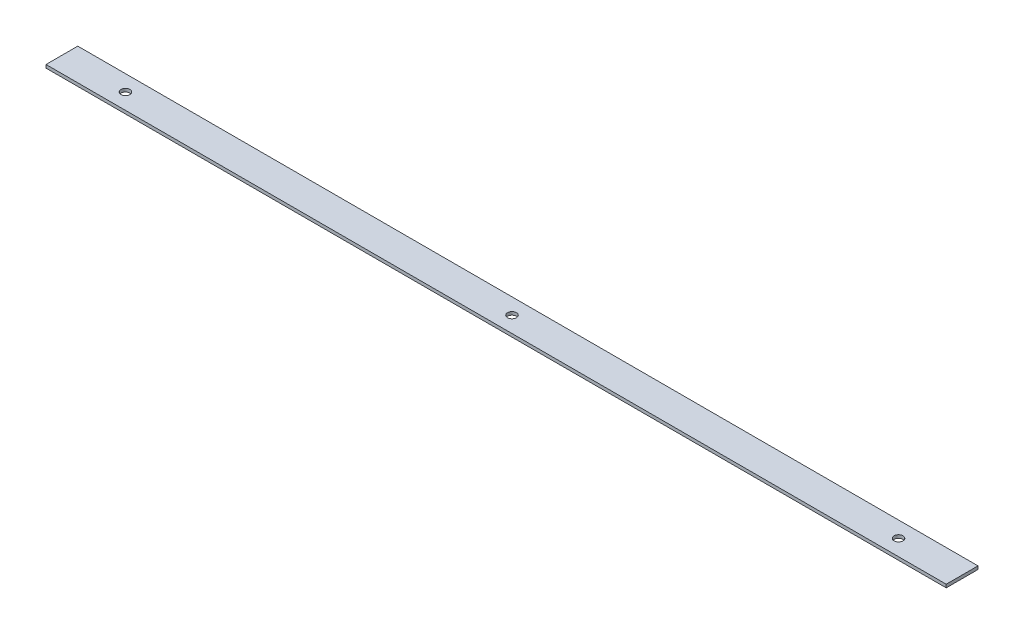
ISO-10303-21;
HEADER;
FILE_DESCRIPTION(('STEP AP214'),'2;1');
FILE_NAME('part.step','',(''),(''),'','','');
FILE_SCHEMA(('AUTOMOTIVE_DESIGN { 1 0 10303 214 1 1 1 1 }'));
ENDSEC;
DATA;
#1=APPLICATION_CONTEXT('core data for automotive mechanical design processes');
#2=APPLICATION_PROTOCOL_DEFINITION('international standard','automotive_design',2000,#1);
#3=PRODUCT_CONTEXT('',#1,'mechanical');
#4=PRODUCT('Part','Part','',(#3));
#5=PRODUCT_RELATED_PRODUCT_CATEGORY('part','',(#4));
#6=PRODUCT_DEFINITION_FORMATION('','',#4);
#7=PRODUCT_DEFINITION_CONTEXT('part definition',#1,'design');
#8=PRODUCT_DEFINITION('design','',#6,#7);
#9=PRODUCT_DEFINITION_SHAPE('','',#8);
#10=(LENGTH_UNIT() NAMED_UNIT(*) SI_UNIT(.MILLI.,.METRE.));
#11=(NAMED_UNIT(*) PLANE_ANGLE_UNIT() SI_UNIT($,.RADIAN.));
#12=(NAMED_UNIT(*) SI_UNIT($,.STERADIAN.) SOLID_ANGLE_UNIT());
#13=UNCERTAINTY_MEASURE_WITH_UNIT(LENGTH_MEASURE(1.E-05),#10,'distance_accuracy_value','');
#14=(GEOMETRIC_REPRESENTATION_CONTEXT(3) GLOBAL_UNCERTAINTY_ASSIGNED_CONTEXT((#13)) GLOBAL_UNIT_ASSIGNED_CONTEXT((#10,
#11,#12)) REPRESENTATION_CONTEXT('',''));
#15=CARTESIAN_POINT('',(0.,0.,0.));
#16=DIRECTION('',(0.,0.,1.));
#17=DIRECTION('',(1.,0.,0.));
#18=AXIS2_PLACEMENT_3D('',#15,#16,#17);
#19=CARTESIAN_POINT('',(304.,0.,0.));
#20=DIRECTION('',(0.,1.,0.));
#21=DIRECTION('',(0.,0.,1.));
#22=AXIS2_PLACEMENT_3D('',#19,#20,#21);
#23=CYLINDRICAL_SURFACE('',#22,3.50000000000008);
#24=CARTESIAN_POINT('',(304.,0.,0.));
#25=DIRECTION('',(0.,1.,0.));
#26=DIRECTION('',(0.,0.,1.));
#27=AXIS2_PLACEMENT_3D('',#24,#25,#26);
#28=CIRCLE('',#27,3.50000000000008);
#29=CARTESIAN_POINT('',(304.,0.,3.50000000000008));
#30=VERTEX_POINT('',#29);
#31=EDGE_CURVE('E48',#30,#30,#28,.T.);
#32=ORIENTED_EDGE('',*,*,#31,.F.);
#33=EDGE_LOOP('',(#32));
#34=FACE_BOUND('',#33,.T.);
#35=CARTESIAN_POINT('',(304.,2.5,0.));
#36=DIRECTION('',(0.,-1.,0.));
#37=DIRECTION('',(0.,0.,-1.));
#38=AXIS2_PLACEMENT_3D('',#35,#36,#37);
#39=CIRCLE('',#38,3.50000000000008);
#40=CARTESIAN_POINT('',(304.,2.5,-3.50000000000008));
#41=VERTEX_POINT('',#40);
#42=EDGE_CURVE('E11',#41,#41,#39,.T.);
#43=ORIENTED_EDGE('',*,*,#42,.F.);
#44=EDGE_LOOP('',(#43));
#45=FACE_BOUND('',#44,.T.);
#46=ADVANCED_FACE('F39',(#34,#45),#23,.F.);
#47=CARTESIAN_POINT('',(354.,2.5,12.5));
#48=DIRECTION('',(-1.,0.,0.));
#49=DIRECTION('',(0.,0.,1.));
#50=AXIS2_PLACEMENT_3D('',#47,#48,#49);
#51=PLANE('',#50);
#52=DIRECTION('',(0.,0.,-1.));
#53=VECTOR('',#52,1.);
#54=CARTESIAN_POINT('',(354.,0.,12.5));
#55=LINE('',#54,#53);
#56=CARTESIAN_POINT('',(354.,0.,12.5));
#57=VERTEX_POINT('',#56);
#58=CARTESIAN_POINT('',(354.,0.,-12.5));
#59=VERTEX_POINT('',#58);
#60=EDGE_CURVE('E112',#57,#59,#55,.T.);
#61=ORIENTED_EDGE('',*,*,#60,.T.);
#62=DIRECTION('',(0.,-1.,0.));
#63=VECTOR('',#62,1.);
#64=CARTESIAN_POINT('',(354.,2.5,-12.5));
#65=LINE('',#64,#63);
#66=CARTESIAN_POINT('',(354.,2.5,-12.5));
#67=VERTEX_POINT('',#66);
#68=EDGE_CURVE('E101',#67,#59,#65,.T.);
#69=ORIENTED_EDGE('',*,*,#68,.F.);
#70=DIRECTION('',(0.,0.,-1.));
#71=VECTOR('',#70,1.);
#72=CARTESIAN_POINT('',(354.,2.5,12.5));
#73=LINE('',#72,#71);
#74=CARTESIAN_POINT('',(354.,2.5,12.5));
#75=VERTEX_POINT('',#74);
#76=EDGE_CURVE('E93',#75,#67,#73,.T.);
#77=ORIENTED_EDGE('',*,*,#76,.F.);
#78=DIRECTION('',(0.,-1.,0.));
#79=VECTOR('',#78,1.);
#80=CARTESIAN_POINT('',(354.,2.5,12.5));
#81=LINE('',#80,#79);
#82=EDGE_CURVE('E108',#75,#57,#81,.T.);
#83=ORIENTED_EDGE('',*,*,#82,.T.);
#84=EDGE_LOOP('',(#61,#69,#77,#83));
#85=FACE_BOUND('',#84,.T.);
#86=ADVANCED_FACE('F136',(#85),#51,.F.);
#87=CARTESIAN_POINT('',(-354.,2.5,-12.5));
#88=DIRECTION('',(0.,0.,1.));
#89=DIRECTION('',(1.,0.,0.));
#90=AXIS2_PLACEMENT_3D('',#87,#88,#89);
#91=PLANE('',#90);
#92=DIRECTION('',(-1.,0.,0.));
#93=VECTOR('',#92,1.);
#94=CARTESIAN_POINT('',(-354.,0.,-12.5));
#95=LINE('',#94,#93);
#96=CARTESIAN_POINT('',(-354.,0.,-12.5));
#97=VERTEX_POINT('',#96);
#98=EDGE_CURVE('E99',#59,#97,#95,.T.);
#99=ORIENTED_EDGE('',*,*,#98,.T.);
#100=DIRECTION('',(0.,-1.,0.));
#101=VECTOR('',#100,1.);
#102=CARTESIAN_POINT('',(-354.,2.5,-12.5));
#103=LINE('',#102,#101);
#104=CARTESIAN_POINT('',(-354.,2.5,-12.5));
#105=VERTEX_POINT('',#104);
#106=EDGE_CURVE('E97',#105,#97,#103,.T.);
#107=ORIENTED_EDGE('',*,*,#106,.F.);
#108=DIRECTION('',(-1.,0.,0.));
#109=VECTOR('',#108,1.);
#110=CARTESIAN_POINT('',(-354.,2.5,-12.5));
#111=LINE('',#110,#109);
#112=EDGE_CURVE('E87',#67,#105,#111,.T.);
#113=ORIENTED_EDGE('',*,*,#112,.F.);
#114=ORIENTED_EDGE('',*,*,#68,.T.);
#115=EDGE_LOOP('',(#99,#107,#113,#114));
#116=FACE_BOUND('',#115,.T.);
#117=ADVANCED_FACE('F98',(#116),#91,.F.);
#118=CARTESIAN_POINT('',(-354.,2.5,12.5));
#119=DIRECTION('',(1.,0.,0.));
#120=DIRECTION('',(0.,0.,-1.));
#121=AXIS2_PLACEMENT_3D('',#118,#119,#120);
#122=PLANE('',#121);
#123=DIRECTION('',(0.,0.,1.));
#124=VECTOR('',#123,1.);
#125=CARTESIAN_POINT('',(-354.,0.,12.5));
#126=LINE('',#125,#124);
#127=CARTESIAN_POINT('',(-354.,0.,12.5));
#128=VERTEX_POINT('',#127);
#129=EDGE_CURVE('E73',#97,#128,#126,.T.);
#130=ORIENTED_EDGE('',*,*,#129,.T.);
#131=DIRECTION('',(0.,-1.,0.));
#132=VECTOR('',#131,1.);
#133=CARTESIAN_POINT('',(-354.,2.5,12.5));
#134=LINE('',#133,#132);
#135=CARTESIAN_POINT('',(-354.,2.5,12.5));
#136=VERTEX_POINT('',#135);
#137=EDGE_CURVE('E102',#136,#128,#134,.T.);
#138=ORIENTED_EDGE('',*,*,#137,.F.);
#139=DIRECTION('',(0.,0.,1.));
#140=VECTOR('',#139,1.);
#141=CARTESIAN_POINT('',(-354.,2.5,12.5));
#142=LINE('',#141,#140);
#143=EDGE_CURVE('E91',#105,#136,#142,.T.);
#144=ORIENTED_EDGE('',*,*,#143,.F.);
#145=ORIENTED_EDGE('',*,*,#106,.T.);
#146=EDGE_LOOP('',(#130,#138,#144,#145));
#147=FACE_BOUND('',#146,.T.);
#148=ADVANCED_FACE('F104',(#147),#122,.F.);
#149=CARTESIAN_POINT('',(-354.,2.5,12.5));
#150=DIRECTION('',(0.,0.,-1.));
#151=DIRECTION('',(-1.,0.,0.));
#152=AXIS2_PLACEMENT_3D('',#149,#150,#151);
#153=PLANE('',#152);
#154=DIRECTION('',(1.,0.,0.));
#155=VECTOR('',#154,1.);
#156=CARTESIAN_POINT('',(-354.,0.,12.5));
#157=LINE('',#156,#155);
#158=EDGE_CURVE('E79',#128,#57,#157,.T.);
#159=ORIENTED_EDGE('',*,*,#158,.T.);
#160=ORIENTED_EDGE('',*,*,#82,.F.);
#161=DIRECTION('',(1.,0.,0.));
#162=VECTOR('',#161,1.);
#163=CARTESIAN_POINT('',(-354.,2.5,12.5));
#164=LINE('',#163,#162);
#165=EDGE_CURVE('E56',#136,#75,#164,.T.);
#166=ORIENTED_EDGE('',*,*,#165,.F.);
#167=ORIENTED_EDGE('',*,*,#137,.T.);
#168=EDGE_LOOP('',(#159,#160,#166,#167));
#169=FACE_BOUND('',#168,.T.);
#170=ADVANCED_FACE('F139',(#169),#153,.F.);
#171=CARTESIAN_POINT('',(0.,2.5,0.));
#172=DIRECTION('',(0.,-1.,0.));
#173=DIRECTION('',(0.,0.,-1.));
#174=AXIS2_PLACEMENT_3D('',#171,#172,#173);
#175=PLANE('',#174);
#176=CARTESIAN_POINT('',(0.,2.5,0.));
#177=DIRECTION('',(0.,-1.,0.));
#178=DIRECTION('',(0.,0.,-1.));
#179=AXIS2_PLACEMENT_3D('',#176,#177,#178);
#180=CIRCLE('',#179,3.50000000000008);
#181=CARTESIAN_POINT('',(0.,2.5,-3.50000000000008));
#182=VERTEX_POINT('',#181);
#183=EDGE_CURVE('E173',#182,#182,#180,.T.);
#184=ORIENTED_EDGE('',*,*,#183,.T.);
#185=EDGE_LOOP('',(#184));
#186=FACE_BOUND('',#185,.T.);
#187=CARTESIAN_POINT('',(-304.,2.5,0.));
#188=DIRECTION('',(0.,-1.,0.));
#189=DIRECTION('',(0.,0.,-1.));
#190=AXIS2_PLACEMENT_3D('',#187,#188,#189);
#191=CIRCLE('',#190,3.50000000000008);
#192=CARTESIAN_POINT('',(-304.,2.5,-3.50000000000008));
#193=VERTEX_POINT('',#192);
#194=EDGE_CURVE('E116',#193,#193,#191,.T.);
#195=ORIENTED_EDGE('',*,*,#194,.T.);
#196=EDGE_LOOP('',(#195));
#197=FACE_BOUND('',#196,.T.);
#198=ORIENTED_EDGE('',*,*,#76,.T.);
#199=ORIENTED_EDGE('',*,*,#112,.T.);
#200=ORIENTED_EDGE('',*,*,#143,.T.);
#201=ORIENTED_EDGE('',*,*,#165,.T.);
#202=EDGE_LOOP('',(#198,#199,#200,#201));
#203=FACE_BOUND('',#202,.T.);
#204=ORIENTED_EDGE('',*,*,#42,.T.);
#205=EDGE_LOOP('',(#204));
#206=FACE_BOUND('',#205,.T.);
#207=ADVANCED_FACE('F88',(#186,#197,#203,#206),#175,.F.);
#208=CARTESIAN_POINT('',(0.,0.,0.));
#209=DIRECTION('',(0.,-1.,0.));
#210=DIRECTION('',(0.,0.,-1.));
#211=AXIS2_PLACEMENT_3D('',#208,#209,#210);
#212=PLANE('',#211);
#213=CARTESIAN_POINT('',(0.,0.,0.));
#214=DIRECTION('',(0.,1.,0.));
#215=DIRECTION('',(0.,0.,1.));
#216=AXIS2_PLACEMENT_3D('',#213,#214,#215);
#217=CIRCLE('',#216,3.50000000000008);
#218=CARTESIAN_POINT('',(0.,0.,3.50000000000008));
#219=VERTEX_POINT('',#218);
#220=EDGE_CURVE('E176',#219,#219,#217,.T.);
#221=ORIENTED_EDGE('',*,*,#220,.T.);
#222=EDGE_LOOP('',(#221));
#223=FACE_BOUND('',#222,.T.);
#224=CARTESIAN_POINT('',(-304.,0.,0.));
#225=DIRECTION('',(0.,1.,0.));
#226=DIRECTION('',(0.,0.,1.));
#227=AXIS2_PLACEMENT_3D('',#224,#225,#226);
#228=CIRCLE('',#227,3.50000000000008);
#229=CARTESIAN_POINT('',(-304.,0.,3.50000000000008));
#230=VERTEX_POINT('',#229);
#231=EDGE_CURVE('E169',#230,#230,#228,.T.);
#232=ORIENTED_EDGE('',*,*,#231,.T.);
#233=EDGE_LOOP('',(#232));
#234=FACE_BOUND('',#233,.T.);
#235=ORIENTED_EDGE('',*,*,#60,.F.);
#236=ORIENTED_EDGE('',*,*,#158,.F.);
#237=ORIENTED_EDGE('',*,*,#129,.F.);
#238=ORIENTED_EDGE('',*,*,#98,.F.);
#239=EDGE_LOOP('',(#235,#236,#237,#238));
#240=FACE_BOUND('',#239,.T.);
#241=ORIENTED_EDGE('',*,*,#31,.T.);
#242=EDGE_LOOP('',(#241));
#243=FACE_BOUND('',#242,.T.);
#244=ADVANCED_FACE('F132',(#223,#234,#240,#243),#212,.T.);
#245=CARTESIAN_POINT('',(-304.,0.,0.));
#246=DIRECTION('',(0.,1.,0.));
#247=DIRECTION('',(0.,0.,1.));
#248=AXIS2_PLACEMENT_3D('',#245,#246,#247);
#249=CYLINDRICAL_SURFACE('',#248,3.50000000000008);
#250=ORIENTED_EDGE('',*,*,#231,.F.);
#251=EDGE_LOOP('',(#250));
#252=FACE_BOUND('',#251,.T.);
#253=ORIENTED_EDGE('',*,*,#194,.F.);
#254=EDGE_LOOP('',(#253));
#255=FACE_BOUND('',#254,.T.);
#256=ADVANCED_FACE('F146',(#252,#255),#249,.F.);
#257=CARTESIAN_POINT('',(0.,0.,0.));
#258=DIRECTION('',(0.,1.,0.));
#259=DIRECTION('',(0.,0.,1.));
#260=AXIS2_PLACEMENT_3D('',#257,#258,#259);
#261=CYLINDRICAL_SURFACE('',#260,3.50000000000008);
#262=ORIENTED_EDGE('',*,*,#220,.F.);
#263=EDGE_LOOP('',(#262));
#264=FACE_BOUND('',#263,.T.);
#265=ORIENTED_EDGE('',*,*,#183,.F.);
#266=EDGE_LOOP('',(#265));
#267=FACE_BOUND('',#266,.T.);
#268=ADVANCED_FACE('F182',(#264,#267),#261,.F.);
#269=CLOSED_SHELL('',(#46,#86,#117,#148,#170,#207,#244,#256,#268));
#270=MANIFOLD_SOLID_BREP('B2',#269);
#271=ADVANCED_BREP_SHAPE_REPRESENTATION('',(#18,#270),#14);
#272=SHAPE_DEFINITION_REPRESENTATION(#9,#271);
ENDSEC;
END-ISO-10303-21;
